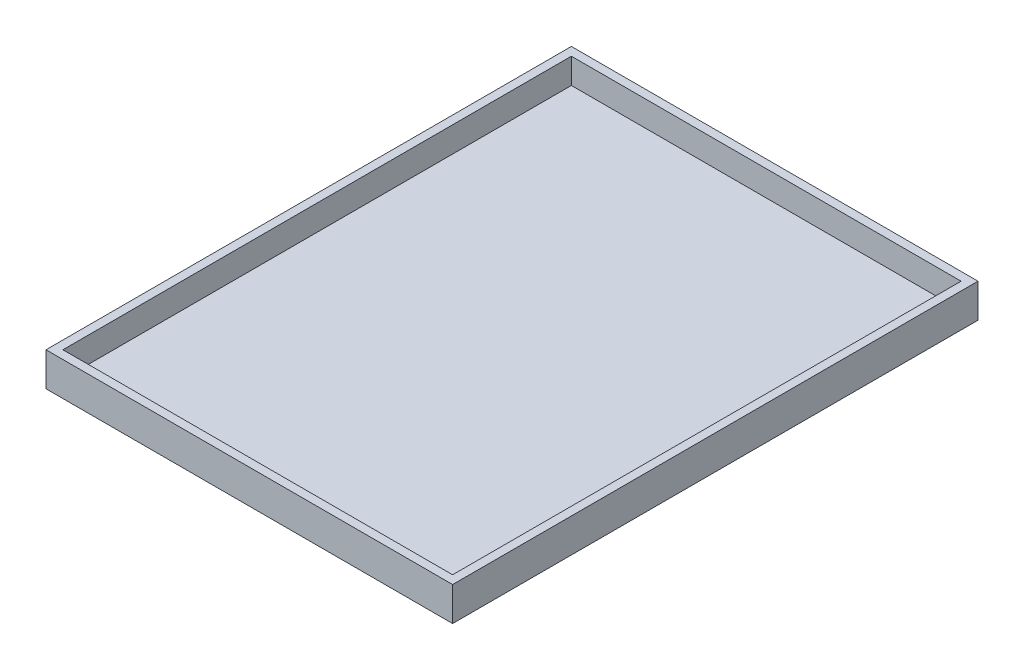
ISO-10303-21;
HEADER;
FILE_DESCRIPTION(('STEP AP214'),'2;1');
FILE_NAME('part.step','',(''),(''),'','','');
FILE_SCHEMA(('AUTOMOTIVE_DESIGN { 1 0 10303 214 1 1 1 1 }'));
ENDSEC;
DATA;
#1=APPLICATION_CONTEXT('core data for automotive mechanical design processes');
#2=APPLICATION_PROTOCOL_DEFINITION('international standard','automotive_design',2000,#1);
#3=PRODUCT_CONTEXT('',#1,'mechanical');
#4=PRODUCT('Part','Part','',(#3));
#5=PRODUCT_RELATED_PRODUCT_CATEGORY('part','',(#4));
#6=PRODUCT_DEFINITION_FORMATION('','',#4);
#7=PRODUCT_DEFINITION_CONTEXT('part definition',#1,'design');
#8=PRODUCT_DEFINITION('design','',#6,#7);
#9=PRODUCT_DEFINITION_SHAPE('','',#8);
#10=(LENGTH_UNIT() NAMED_UNIT(*) SI_UNIT(.MILLI.,.METRE.));
#11=(NAMED_UNIT(*) PLANE_ANGLE_UNIT() SI_UNIT($,.RADIAN.));
#12=(NAMED_UNIT(*) SI_UNIT($,.STERADIAN.) SOLID_ANGLE_UNIT());
#13=UNCERTAINTY_MEASURE_WITH_UNIT(LENGTH_MEASURE(1.E-05),#10,'distance_accuracy_value','');
#14=(GEOMETRIC_REPRESENTATION_CONTEXT(3) GLOBAL_UNCERTAINTY_ASSIGNED_CONTEXT((#13)) GLOBAL_UNIT_ASSIGNED_CONTEXT((#10,
#11,#12)) REPRESENTATION_CONTEXT('',''));
#15=CARTESIAN_POINT('',(0.,0.,0.));
#16=DIRECTION('',(0.,0.,1.));
#17=DIRECTION('',(1.,0.,0.));
#18=AXIS2_PLACEMENT_3D('',#15,#16,#17);
#19=CARTESIAN_POINT('',(192.4,4.,-248.6));
#20=DIRECTION('',(-1.,0.,0.));
#21=DIRECTION('',(0.,0.,1.));
#22=AXIS2_PLACEMENT_3D('',#19,#20,#21);
#23=PLANE('',#22);
#24=DIRECTION('',(0.,0.,-1.));
#25=VECTOR('',#24,1.);
#26=CARTESIAN_POINT('',(192.4,-4.,-248.6));
#27=LINE('',#26,#25);
#28=CARTESIAN_POINT('',(192.4,-4.,248.6));
#29=VERTEX_POINT('',#28);
#30=CARTESIAN_POINT('',(192.4,-4.,-248.6));
#31=VERTEX_POINT('',#30);
#32=EDGE_CURVE('E173',#29,#31,#27,.T.);
#33=ORIENTED_EDGE('',*,*,#32,.T.);
#34=DIRECTION('',(0.,-1.,0.));
#35=VECTOR('',#34,1.);
#36=CARTESIAN_POINT('',(192.4,4.,-248.6));
#37=LINE('',#36,#35);
#38=CARTESIAN_POINT('',(192.4,28.,-248.6));
#39=VERTEX_POINT('',#38);
#40=EDGE_CURVE('E11',#39,#31,#37,.T.);
#41=ORIENTED_EDGE('',*,*,#40,.F.);
#42=DIRECTION('',(0.,0.,-1.));
#43=VECTOR('',#42,1.);
#44=CARTESIAN_POINT('',(192.4,28.,248.6));
#45=LINE('',#44,#43);
#46=CARTESIAN_POINT('',(192.4,28.,248.6));
#47=VERTEX_POINT('',#46);
#48=EDGE_CURVE('E161',#47,#39,#45,.T.);
#49=ORIENTED_EDGE('',*,*,#48,.F.);
#50=DIRECTION('',(0.,-1.,0.));
#51=VECTOR('',#50,1.);
#52=CARTESIAN_POINT('',(192.4,4.,248.6));
#53=LINE('',#52,#51);
#54=EDGE_CURVE('E186',#47,#29,#53,.T.);
#55=ORIENTED_EDGE('',*,*,#54,.T.);
#56=EDGE_LOOP('',(#33,#41,#49,#55));
#57=FACE_BOUND('',#56,.T.);
#58=ADVANCED_FACE('F45',(#57),#23,.F.);
#59=CARTESIAN_POINT('',(-192.4,4.,-248.6));
#60=DIRECTION('',(0.,0.,1.));
#61=DIRECTION('',(1.,0.,0.));
#62=AXIS2_PLACEMENT_3D('',#59,#60,#61);
#63=PLANE('',#62);
#64=DIRECTION('',(-1.,0.,0.));
#65=VECTOR('',#64,1.);
#66=CARTESIAN_POINT('',(-192.4,-4.,-248.6));
#67=LINE('',#66,#65);
#68=CARTESIAN_POINT('',(-192.4,-4.,-248.6));
#69=VERTEX_POINT('',#68);
#70=EDGE_CURVE('E177',#31,#69,#67,.T.);
#71=ORIENTED_EDGE('',*,*,#70,.T.);
#72=DIRECTION('',(0.,-1.,0.));
#73=VECTOR('',#72,1.);
#74=CARTESIAN_POINT('',(-192.4,4.,-248.6));
#75=LINE('',#74,#73);
#76=CARTESIAN_POINT('',(-192.4,28.,-248.6));
#77=VERTEX_POINT('',#76);
#78=EDGE_CURVE('E53',#77,#69,#75,.T.);
#79=ORIENTED_EDGE('',*,*,#78,.F.);
#80=DIRECTION('',(-1.,0.,0.));
#81=VECTOR('',#80,1.);
#82=CARTESIAN_POINT('',(192.4,28.,-248.6));
#83=LINE('',#82,#81);
#84=EDGE_CURVE('E165',#39,#77,#83,.T.);
#85=ORIENTED_EDGE('',*,*,#84,.F.);
#86=ORIENTED_EDGE('',*,*,#40,.T.);
#87=EDGE_LOOP('',(#71,#79,#85,#86));
#88=FACE_BOUND('',#87,.T.);
#89=ADVANCED_FACE('F211',(#88),#63,.F.);
#90=CARTESIAN_POINT('',(-192.4,4.,-248.6));
#91=DIRECTION('',(1.,0.,0.));
#92=DIRECTION('',(0.,0.,-1.));
#93=AXIS2_PLACEMENT_3D('',#90,#91,#92);
#94=PLANE('',#93);
#95=DIRECTION('',(0.,0.,1.));
#96=VECTOR('',#95,1.);
#97=CARTESIAN_POINT('',(-192.4,-4.,-248.6));
#98=LINE('',#97,#96);
#99=CARTESIAN_POINT('',(-192.4,-4.,248.6));
#100=VERTEX_POINT('',#99);
#101=EDGE_CURVE('E180',#69,#100,#98,.T.);
#102=ORIENTED_EDGE('',*,*,#101,.T.);
#103=DIRECTION('',(0.,-1.,0.));
#104=VECTOR('',#103,1.);
#105=CARTESIAN_POINT('',(-192.4,4.,248.6));
#106=LINE('',#105,#104);
#107=CARTESIAN_POINT('',(-192.4,28.,248.6));
#108=VERTEX_POINT('',#107);
#109=EDGE_CURVE('E190',#108,#100,#106,.T.);
#110=ORIENTED_EDGE('',*,*,#109,.F.);
#111=DIRECTION('',(0.,0.,1.));
#112=VECTOR('',#111,1.);
#113=CARTESIAN_POINT('',(-192.4,28.,-248.6));
#114=LINE('',#113,#112);
#115=EDGE_CURVE('E169',#77,#108,#114,.T.);
#116=ORIENTED_EDGE('',*,*,#115,.F.);
#117=ORIENTED_EDGE('',*,*,#78,.T.);
#118=EDGE_LOOP('',(#102,#110,#116,#117));
#119=FACE_BOUND('',#118,.T.);
#120=ADVANCED_FACE('F198',(#119),#94,.F.);
#121=CARTESIAN_POINT('',(-192.4,4.,248.6));
#122=DIRECTION('',(0.,0.,-1.));
#123=DIRECTION('',(-1.,0.,0.));
#124=AXIS2_PLACEMENT_3D('',#121,#122,#123);
#125=PLANE('',#124);
#126=DIRECTION('',(1.,0.,0.));
#127=VECTOR('',#126,1.);
#128=CARTESIAN_POINT('',(-192.4,-4.,248.6));
#129=LINE('',#128,#127);
#130=EDGE_CURVE('E183',#100,#29,#129,.T.);
#131=ORIENTED_EDGE('',*,*,#130,.T.);
#132=ORIENTED_EDGE('',*,*,#54,.F.);
#133=DIRECTION('',(1.,0.,0.));
#134=VECTOR('',#133,1.);
#135=CARTESIAN_POINT('',(-192.4,28.,248.6));
#136=LINE('',#135,#134);
#137=EDGE_CURVE('E126',#108,#47,#136,.T.);
#138=ORIENTED_EDGE('',*,*,#137,.F.);
#139=ORIENTED_EDGE('',*,*,#109,.T.);
#140=EDGE_LOOP('',(#131,#132,#138,#139));
#141=FACE_BOUND('',#140,.T.);
#142=ADVANCED_FACE('F206',(#141),#125,.F.);
#143=CARTESIAN_POINT('',(0.,-4.,0.));
#144=DIRECTION('',(0.,1.,0.));
#145=DIRECTION('',(0.,0.,1.));
#146=AXIS2_PLACEMENT_3D('',#143,#144,#145);
#147=PLANE('',#146);
#148=ORIENTED_EDGE('',*,*,#32,.F.);
#149=ORIENTED_EDGE('',*,*,#130,.F.);
#150=ORIENTED_EDGE('',*,*,#101,.F.);
#151=ORIENTED_EDGE('',*,*,#70,.F.);
#152=EDGE_LOOP('',(#148,#149,#150,#151));
#153=FACE_BOUND('',#152,.T.);
#154=ADVANCED_FACE('F204',(#153),#147,.F.);
#155=CARTESIAN_POINT('',(0.,28.,0.));
#156=DIRECTION('',(0.,1.,0.));
#157=DIRECTION('',(0.,0.,1.));
#158=AXIS2_PLACEMENT_3D('',#155,#156,#157);
#159=PLANE('',#158);
#160=ORIENTED_EDGE('',*,*,#137,.T.);
#161=ORIENTED_EDGE('',*,*,#48,.T.);
#162=ORIENTED_EDGE('',*,*,#84,.T.);
#163=ORIENTED_EDGE('',*,*,#115,.T.);
#164=EDGE_LOOP('',(#160,#161,#162,#163));
#165=FACE_BOUND('',#164,.T.);
#166=DIRECTION('',(0.,0.,-1.));
#167=VECTOR('',#166,1.);
#168=CARTESIAN_POINT('',(184.4,28.,240.6));
#169=LINE('',#168,#167);
#170=CARTESIAN_POINT('',(184.4,28.,240.6));
#171=VERTEX_POINT('',#170);
#172=CARTESIAN_POINT('',(184.4,28.,-240.6));
#173=VERTEX_POINT('',#172);
#174=EDGE_CURVE('E119',#171,#173,#169,.T.);
#175=ORIENTED_EDGE('',*,*,#174,.F.);
#176=DIRECTION('',(1.,0.,0.));
#177=VECTOR('',#176,1.);
#178=CARTESIAN_POINT('',(-184.4,28.,240.6));
#179=LINE('',#178,#177);
#180=CARTESIAN_POINT('',(-184.4,28.,240.6));
#181=VERTEX_POINT('',#180);
#182=EDGE_CURVE('E109',#181,#171,#179,.T.);
#183=ORIENTED_EDGE('',*,*,#182,.F.);
#184=DIRECTION('',(0.,0.,1.));
#185=VECTOR('',#184,1.);
#186=CARTESIAN_POINT('',(-184.4,28.,-240.6));
#187=LINE('',#186,#185);
#188=CARTESIAN_POINT('',(-184.4,28.,-240.6));
#189=VERTEX_POINT('',#188);
#190=EDGE_CURVE('E136',#189,#181,#187,.T.);
#191=ORIENTED_EDGE('',*,*,#190,.F.);
#192=DIRECTION('',(-1.,0.,0.));
#193=VECTOR('',#192,1.);
#194=CARTESIAN_POINT('',(184.4,28.,-240.6));
#195=LINE('',#194,#193);
#196=EDGE_CURVE('E132',#173,#189,#195,.T.);
#197=ORIENTED_EDGE('',*,*,#196,.F.);
#198=EDGE_LOOP('',(#175,#183,#191,#197));
#199=FACE_BOUND('',#198,.T.);
#200=ADVANCED_FACE('F130',(#165,#199),#159,.T.);
#201=CARTESIAN_POINT('',(-184.4,28.,240.6));
#202=DIRECTION('',(0.,0.,-1.));
#203=DIRECTION('',(-1.,0.,0.));
#204=AXIS2_PLACEMENT_3D('',#201,#202,#203);
#205=PLANE('',#204);
#206=DIRECTION('',(1.,0.,0.));
#207=VECTOR('',#206,1.);
#208=CARTESIAN_POINT('',(-184.4,4.,240.6));
#209=LINE('',#208,#207);
#210=CARTESIAN_POINT('',(-184.4,4.,240.6));
#211=VERTEX_POINT('',#210);
#212=CARTESIAN_POINT('',(184.4,4.,240.6));
#213=VERTEX_POINT('',#212);
#214=EDGE_CURVE('E60',#211,#213,#209,.T.);
#215=ORIENTED_EDGE('',*,*,#214,.F.);
#216=DIRECTION('',(0.,-1.,0.));
#217=VECTOR('',#216,1.);
#218=CARTESIAN_POINT('',(-184.4,28.,240.6));
#219=LINE('',#218,#217);
#220=EDGE_CURVE('E114',#181,#211,#219,.T.);
#221=ORIENTED_EDGE('',*,*,#220,.F.);
#222=ORIENTED_EDGE('',*,*,#182,.T.);
#223=DIRECTION('',(0.,-1.,0.));
#224=VECTOR('',#223,1.);
#225=CARTESIAN_POINT('',(184.4,28.,240.6));
#226=LINE('',#225,#224);
#227=EDGE_CURVE('E112',#171,#213,#226,.T.);
#228=ORIENTED_EDGE('',*,*,#227,.T.);
#229=EDGE_LOOP('',(#215,#221,#222,#228));
#230=FACE_BOUND('',#229,.T.);
#231=ADVANCED_FACE('F111',(#230),#205,.T.);
#232=CARTESIAN_POINT('',(184.4,28.,240.6));
#233=DIRECTION('',(-1.,0.,0.));
#234=DIRECTION('',(0.,0.,1.));
#235=AXIS2_PLACEMENT_3D('',#232,#233,#234);
#236=PLANE('',#235);
#237=DIRECTION('',(0.,0.,-1.));
#238=VECTOR('',#237,1.);
#239=CARTESIAN_POINT('',(184.4,4.,240.6));
#240=LINE('',#239,#238);
#241=CARTESIAN_POINT('',(184.4,4.,-240.6));
#242=VERTEX_POINT('',#241);
#243=EDGE_CURVE('E64',#213,#242,#240,.T.);
#244=ORIENTED_EDGE('',*,*,#243,.F.);
#245=ORIENTED_EDGE('',*,*,#227,.F.);
#246=ORIENTED_EDGE('',*,*,#174,.T.);
#247=DIRECTION('',(0.,-1.,0.));
#248=VECTOR('',#247,1.);
#249=CARTESIAN_POINT('',(184.4,28.,-240.6));
#250=LINE('',#249,#248);
#251=EDGE_CURVE('E127',#173,#242,#250,.T.);
#252=ORIENTED_EDGE('',*,*,#251,.T.);
#253=EDGE_LOOP('',(#244,#245,#246,#252));
#254=FACE_BOUND('',#253,.T.);
#255=ADVANCED_FACE('F123',(#254),#236,.T.);
#256=CARTESIAN_POINT('',(184.4,28.,-240.6));
#257=DIRECTION('',(0.,0.,1.));
#258=DIRECTION('',(1.,0.,0.));
#259=AXIS2_PLACEMENT_3D('',#256,#257,#258);
#260=PLANE('',#259);
#261=DIRECTION('',(-1.,0.,0.));
#262=VECTOR('',#261,1.);
#263=CARTESIAN_POINT('',(184.4,4.,-240.6));
#264=LINE('',#263,#262);
#265=CARTESIAN_POINT('',(-184.4,4.,-240.6));
#266=VERTEX_POINT('',#265);
#267=EDGE_CURVE('E145',#242,#266,#264,.T.);
#268=ORIENTED_EDGE('',*,*,#267,.F.);
#269=ORIENTED_EDGE('',*,*,#251,.F.);
#270=ORIENTED_EDGE('',*,*,#196,.T.);
#271=DIRECTION('',(0.,-1.,0.));
#272=VECTOR('',#271,1.);
#273=CARTESIAN_POINT('',(-184.4,28.,-240.6));
#274=LINE('',#273,#272);
#275=EDGE_CURVE('E152',#189,#266,#274,.T.);
#276=ORIENTED_EDGE('',*,*,#275,.T.);
#277=EDGE_LOOP('',(#268,#269,#270,#276));
#278=FACE_BOUND('',#277,.T.);
#279=ADVANCED_FACE('F233',(#278),#260,.T.);
#280=CARTESIAN_POINT('',(-184.4,28.,-240.6));
#281=DIRECTION('',(1.,0.,0.));
#282=DIRECTION('',(0.,0.,-1.));
#283=AXIS2_PLACEMENT_3D('',#280,#281,#282);
#284=PLANE('',#283);
#285=DIRECTION('',(0.,0.,1.));
#286=VECTOR('',#285,1.);
#287=CARTESIAN_POINT('',(-184.4,4.,-240.6));
#288=LINE('',#287,#286);
#289=EDGE_CURVE('E120',#266,#211,#288,.T.);
#290=ORIENTED_EDGE('',*,*,#289,.F.);
#291=ORIENTED_EDGE('',*,*,#275,.F.);
#292=ORIENTED_EDGE('',*,*,#190,.T.);
#293=ORIENTED_EDGE('',*,*,#220,.T.);
#294=EDGE_LOOP('',(#290,#291,#292,#293));
#295=FACE_BOUND('',#294,.T.);
#296=ADVANCED_FACE('F226',(#295),#284,.T.);
#297=CARTESIAN_POINT('',(0.,4.,0.));
#298=DIRECTION('',(0.,1.,0.));
#299=DIRECTION('',(0.,0.,1.));
#300=AXIS2_PLACEMENT_3D('',#297,#298,#299);
#301=PLANE('',#300);
#302=ORIENTED_EDGE('',*,*,#214,.T.);
#303=ORIENTED_EDGE('',*,*,#243,.T.);
#304=ORIENTED_EDGE('',*,*,#267,.T.);
#305=ORIENTED_EDGE('',*,*,#289,.T.);
#306=EDGE_LOOP('',(#302,#303,#304,#305));
#307=FACE_BOUND('',#306,.T.);
#308=ADVANCED_FACE('F223',(#307),#301,.T.);
#309=CLOSED_SHELL('',(#58,#89,#120,#142,#154,#200,#231,#255,#279,#296,#308));
#310=MANIFOLD_SOLID_BREP('B2',#309);
#311=ADVANCED_BREP_SHAPE_REPRESENTATION('',(#18,#310),#14);
#312=SHAPE_DEFINITION_REPRESENTATION(#9,#311);
ENDSEC;
END-ISO-10303-21;
